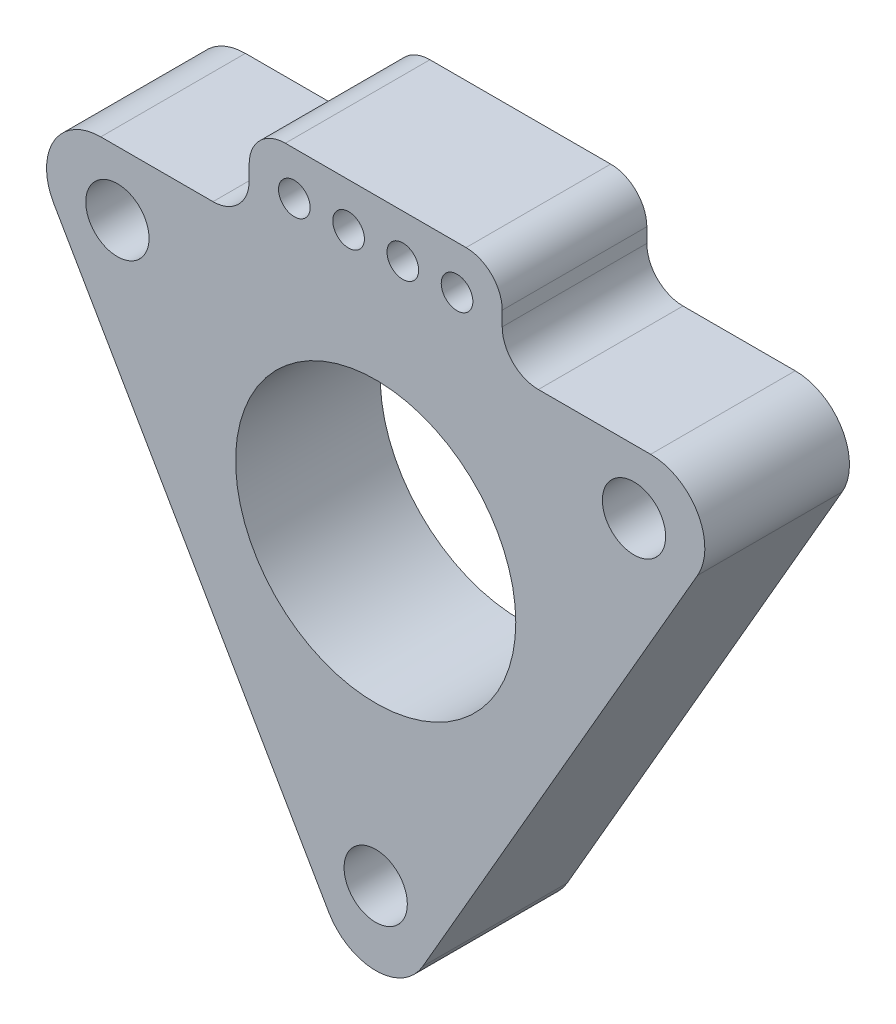
ISO-10303-21;
HEADER;
FILE_DESCRIPTION(('STEP AP214'),'2;1');
FILE_NAME('part.step','',(''),(''),'','','');
FILE_SCHEMA(('AUTOMOTIVE_DESIGN { 1 0 10303 214 1 1 1 1 }'));
ENDSEC;
DATA;
#1=APPLICATION_CONTEXT('core data for automotive mechanical design processes');
#2=APPLICATION_PROTOCOL_DEFINITION('international standard','automotive_design',2000,#1);
#3=PRODUCT_CONTEXT('',#1,'mechanical');
#4=PRODUCT('Part','Part','',(#3));
#5=PRODUCT_RELATED_PRODUCT_CATEGORY('part','',(#4));
#6=PRODUCT_DEFINITION_FORMATION('','',#4);
#7=PRODUCT_DEFINITION_CONTEXT('part definition',#1,'design');
#8=PRODUCT_DEFINITION('design','',#6,#7);
#9=PRODUCT_DEFINITION_SHAPE('','',#8);
#10=(LENGTH_UNIT() NAMED_UNIT(*) SI_UNIT(.MILLI.,.METRE.));
#11=(NAMED_UNIT(*) PLANE_ANGLE_UNIT() SI_UNIT($,.RADIAN.));
#12=(NAMED_UNIT(*) SI_UNIT($,.STERADIAN.) SOLID_ANGLE_UNIT());
#13=UNCERTAINTY_MEASURE_WITH_UNIT(LENGTH_MEASURE(1.E-05),#10,'distance_accuracy_value','');
#14=(GEOMETRIC_REPRESENTATION_CONTEXT(3) GLOBAL_UNCERTAINTY_ASSIGNED_CONTEXT((#13)) GLOBAL_UNIT_ASSIGNED_CONTEXT((#10,
#11,#12)) REPRESENTATION_CONTEXT('',''));
#15=CARTESIAN_POINT('',(0.,0.,0.));
#16=DIRECTION('',(0.,0.,1.));
#17=DIRECTION('',(1.,0.,0.));
#18=AXIS2_PLACEMENT_3D('',#15,#16,#17);
#19=CARTESIAN_POINT('',(20.4053214197768,11.78,8.));
#20=DIRECTION('',(0.,-1.,0.));
#21=DIRECTION('',(0.,0.,-1.));
#22=AXIS2_PLACEMENT_3D('',#19,#20,#21);
#23=PLANE('',#22);
#24=DIRECTION('',(-1.,0.,0.));
#25=VECTOR('',#24,1.);
#26=CARTESIAN_POINT('',(20.4053214197768,11.78,0.));
#27=LINE('',#26,#25);
#28=CARTESIAN_POINT('',(15.2091689970702,11.78,0.));
#29=VERTEX_POINT('',#28);
#30=CARTESIAN_POINT('',(9.,11.78,0.));
#31=VERTEX_POINT('',#30);
#32=EDGE_CURVE('E166',#29,#31,#27,.T.);
#33=ORIENTED_EDGE('',*,*,#32,.T.);
#34=DIRECTION('',(0.,0.,-1.));
#35=VECTOR('',#34,1.);
#36=CARTESIAN_POINT('',(9.,11.78,8.));
#37=LINE('',#36,#35);
#38=CARTESIAN_POINT('',(9.,11.78,8.));
#39=VERTEX_POINT('',#38);
#40=EDGE_CURVE('E222',#31,#39,#37,.F.);
#41=ORIENTED_EDGE('',*,*,#40,.T.);
#42=DIRECTION('',(-1.,0.,0.));
#43=VECTOR('',#42,1.);
#44=CARTESIAN_POINT('',(20.4053214197768,11.78,8.));
#45=LINE('',#44,#43);
#46=CARTESIAN_POINT('',(15.2091689970702,11.78,8.));
#47=VERTEX_POINT('',#46);
#48=EDGE_CURVE('E268',#47,#39,#45,.T.);
#49=ORIENTED_EDGE('',*,*,#48,.F.);
#50=DIRECTION('',(0.,0.,-1.));
#51=VECTOR('',#50,1.);
#52=CARTESIAN_POINT('',(15.2091689970702,11.78,8.));
#53=LINE('',#52,#51);
#54=EDGE_CURVE('E191',#47,#29,#53,.T.);
#55=ORIENTED_EDGE('',*,*,#54,.T.);
#56=EDGE_LOOP('',(#33,#41,#49,#55));
#57=FACE_BOUND('',#56,.T.);
#58=ADVANCED_FACE('F34',(#57),#23,.F.);
#59=CARTESIAN_POINT('',(20.4053214197768,11.78,8.));
#60=DIRECTION('',(0.,0.,1.));
#61=DIRECTION('',(1.,0.,0.));
#62=AXIS2_PLACEMENT_3D('',#59,#60,#61);
#63=PLANE('',#62);
#64=CARTESIAN_POINT('',(-14.2894191628503,8.2499999997305,8.));
#65=DIRECTION('',(0.,0.,1.));
#66=DIRECTION('',(1.,0.,0.));
#67=AXIS2_PLACEMENT_3D('',#64,#65,#66);
#68=CIRCLE('',#67,1.7499965);
#69=CARTESIAN_POINT('',(-12.5394226628503,8.2499999997305,8.));
#70=VERTEX_POINT('',#69);
#71=EDGE_CURVE('E254',#70,#70,#68,.T.);
#72=ORIENTED_EDGE('',*,*,#71,.F.);
#73=EDGE_LOOP('',(#72));
#74=FACE_BOUND('',#73,.T.);
#75=CARTESIAN_POINT('',(0.,-16.49999999968,8.));
#76=DIRECTION('',(0.,0.,1.));
#77=DIRECTION('',(1.,0.,0.));
#78=AXIS2_PLACEMENT_3D('',#75,#76,#77);
#79=CIRCLE('',#78,1.7499965);
#80=CARTESIAN_POINT('',(1.7499965,-16.49999999968,8.));
#81=VERTEX_POINT('',#80);
#82=EDGE_CURVE('E164',#81,#81,#79,.T.);
#83=ORIENTED_EDGE('',*,*,#82,.F.);
#84=EDGE_LOOP('',(#83));
#85=FACE_BOUND('',#84,.T.);
#86=DIRECTION('',(1.,0.,0.));
#87=VECTOR('',#86,1.);
#88=CARTESIAN_POINT('',(7.,16.58,8.));
#89=LINE('',#88,#87);
#90=CARTESIAN_POINT('',(-5.,16.58,8.));
#91=VERTEX_POINT('',#90);
#92=CARTESIAN_POINT('',(5.,16.58,8.));
#93=VERTEX_POINT('',#92);
#94=EDGE_CURVE('E238',#91,#93,#89,.T.);
#95=ORIENTED_EDGE('',*,*,#94,.F.);
#96=CARTESIAN_POINT('',(-5.,14.58,8.));
#97=DIRECTION('',(0.,0.,1.));
#98=DIRECTION('',(1.,0.,0.));
#99=AXIS2_PLACEMENT_3D('',#96,#97,#98);
#100=CIRCLE('',#99,2.);
#101=CARTESIAN_POINT('',(-7.,14.58,8.));
#102=VERTEX_POINT('',#101);
#103=EDGE_CURVE('E216',#91,#102,#100,.T.);
#104=ORIENTED_EDGE('',*,*,#103,.T.);
#105=DIRECTION('',(0.,1.,0.));
#106=VECTOR('',#105,1.);
#107=CARTESIAN_POINT('',(-7.,16.58,8.));
#108=LINE('',#107,#106);
#109=CARTESIAN_POINT('',(-7.,13.78,8.));
#110=VERTEX_POINT('',#109);
#111=EDGE_CURVE('E241',#110,#102,#108,.T.);
#112=ORIENTED_EDGE('',*,*,#111,.F.);
#113=CARTESIAN_POINT('',(-9.,13.78,8.));
#114=DIRECTION('',(0.,0.,1.));
#115=DIRECTION('',(1.,0.,0.));
#116=AXIS2_PLACEMENT_3D('',#113,#114,#115);
#117=CIRCLE('',#116,2.);
#118=CARTESIAN_POINT('',(-9.,11.78,8.));
#119=VERTEX_POINT('',#118);
#120=EDGE_CURVE('E226',#110,#119,#117,.F.);
#121=ORIENTED_EDGE('',*,*,#120,.T.);
#122=CARTESIAN_POINT('',(-15.2091689970702,11.78,8.));
#123=VERTEX_POINT('',#122);
#124=EDGE_CURVE('E267',#119,#123,#45,.T.);
#125=ORIENTED_EDGE('',*,*,#124,.T.);
#126=CARTESIAN_POINT('',(-15.2091689970702,8.78,8.));
#127=DIRECTION('',(0.,0.,1.));
#128=DIRECTION('',(1.,0.,0.));
#129=AXIS2_PLACEMENT_3D('',#126,#127,#128);
#130=CIRCLE('',#129,3.);
#131=CARTESIAN_POINT('',(-17.8072452084235,7.28,8.));
#132=VERTEX_POINT('',#131);
#133=EDGE_CURVE('E187',#123,#132,#130,.T.);
#134=ORIENTED_EDGE('',*,*,#133,.T.);
#135=DIRECTION('',(0.499999999999998,-0.86602540378444,0.));
#136=VECTOR('',#135,1.);
#137=CARTESIAN_POINT('',(-20.4053214197768,11.78,8.));
#138=LINE('',#137,#136);
#139=CARTESIAN_POINT('',(-2.59807621135331,-19.0630534438271,8.));
#140=VERTEX_POINT('',#139);
#141=EDGE_CURVE('E172',#132,#140,#138,.T.);
#142=ORIENTED_EDGE('',*,*,#141,.T.);
#143=CARTESIAN_POINT('',(0.,-17.5630534438271,8.));
#144=DIRECTION('',(0.,0.,1.));
#145=DIRECTION('',(1.,0.,0.));
#146=AXIS2_PLACEMENT_3D('',#143,#144,#145);
#147=CIRCLE('',#146,3.);
#148=CARTESIAN_POINT('',(2.59807621135332,-19.0630534438271,8.));
#149=VERTEX_POINT('',#148);
#150=EDGE_CURVE('E189',#140,#149,#147,.T.);
#151=ORIENTED_EDGE('',*,*,#150,.T.);
#152=DIRECTION('',(0.499999999999998,0.86602540378444,0.));
#153=VECTOR('',#152,1.);
#154=CARTESIAN_POINT('',(0.,-23.5630534438271,8.));
#155=LINE('',#154,#153);
#156=CARTESIAN_POINT('',(17.8072452084235,7.28,8.));
#157=VERTEX_POINT('',#156);
#158=EDGE_CURVE('E155',#149,#157,#155,.T.);
#159=ORIENTED_EDGE('',*,*,#158,.T.);
#160=CARTESIAN_POINT('',(15.2091689970702,8.78,8.));
#161=DIRECTION('',(0.,0.,1.));
#162=DIRECTION('',(1.,0.,0.));
#163=AXIS2_PLACEMENT_3D('',#160,#161,#162);
#164=CIRCLE('',#163,3.);
#165=EDGE_CURVE('E185',#157,#47,#164,.T.);
#166=ORIENTED_EDGE('',*,*,#165,.T.);
#167=ORIENTED_EDGE('',*,*,#48,.T.);
#168=CARTESIAN_POINT('',(9.,13.78,8.));
#169=DIRECTION('',(0.,0.,1.));
#170=DIRECTION('',(1.,0.,0.));
#171=AXIS2_PLACEMENT_3D('',#168,#169,#170);
#172=CIRCLE('',#171,2.);
#173=CARTESIAN_POINT('',(7.,13.78,8.));
#174=VERTEX_POINT('',#173);
#175=EDGE_CURVE('E11',#39,#174,#172,.F.);
#176=ORIENTED_EDGE('',*,*,#175,.T.);
#177=DIRECTION('',(0.,-1.,0.));
#178=VECTOR('',#177,1.);
#179=CARTESIAN_POINT('',(7.,11.78,8.));
#180=LINE('',#179,#178);
#181=CARTESIAN_POINT('',(7.,14.58,8.));
#182=VERTEX_POINT('',#181);
#183=EDGE_CURVE('E236',#182,#174,#180,.T.);
#184=ORIENTED_EDGE('',*,*,#183,.F.);
#185=CARTESIAN_POINT('',(5.,14.58,8.));
#186=DIRECTION('',(0.,0.,1.));
#187=DIRECTION('',(1.,0.,0.));
#188=AXIS2_PLACEMENT_3D('',#185,#186,#187);
#189=CIRCLE('',#188,2.);
#190=EDGE_CURVE('E214',#182,#93,#189,.T.);
#191=ORIENTED_EDGE('',*,*,#190,.T.);
#192=EDGE_LOOP('',(#95,#104,#112,#121,#125,#134,#142,#151,#159,#166,#167,#176,#184,#191));
#193=FACE_BOUND('',#192,.T.);
#194=CARTESIAN_POINT('',(0.,0.,8.));
#195=DIRECTION('',(0.,0.,1.));
#196=DIRECTION('',(1.,0.,0.));
#197=AXIS2_PLACEMENT_3D('',#194,#195,#196);
#198=CIRCLE('',#197,7.74999999999999);
#199=CARTESIAN_POINT('',(7.74999999999999,0.,8.));
#200=VERTEX_POINT('',#199);
#201=EDGE_CURVE('E260',#200,#200,#198,.T.);
#202=ORIENTED_EDGE('',*,*,#201,.F.);
#203=EDGE_LOOP('',(#202));
#204=FACE_BOUND('',#203,.T.);
#205=CARTESIAN_POINT('',(14.2894191628503,8.2499999997305,8.));
#206=DIRECTION('',(0.,0.,1.));
#207=DIRECTION('',(1.,0.,0.));
#208=AXIS2_PLACEMENT_3D('',#205,#206,#207);
#209=CIRCLE('',#208,1.7499965);
#210=CARTESIAN_POINT('',(16.0394156628503,8.2499999997305,8.));
#211=VERTEX_POINT('',#210);
#212=EDGE_CURVE('E246',#211,#211,#209,.T.);
#213=ORIENTED_EDGE('',*,*,#212,.F.);
#214=EDGE_LOOP('',(#213));
#215=FACE_BOUND('',#214,.T.);
#216=CARTESIAN_POINT('',(4.5,14.18,8.));
#217=DIRECTION('',(0.,0.,1.));
#218=DIRECTION('',(1.,0.,0.));
#219=AXIS2_PLACEMENT_3D('',#216,#217,#218);
#220=CIRCLE('',#219,0.875000000000001);
#221=CARTESIAN_POINT('',(5.375,14.18,8.));
#222=VERTEX_POINT('',#221);
#223=EDGE_CURVE('E534',#222,#222,#220,.F.);
#224=ORIENTED_EDGE('',*,*,#223,.T.);
#225=EDGE_LOOP('',(#224));
#226=FACE_BOUND('',#225,.T.);
#227=CARTESIAN_POINT('',(-4.5,14.18,8.));
#228=DIRECTION('',(0.,0.,1.));
#229=DIRECTION('',(1.,0.,0.));
#230=AXIS2_PLACEMENT_3D('',#227,#228,#229);
#231=CIRCLE('',#230,0.875);
#232=CARTESIAN_POINT('',(-3.625,14.18,8.));
#233=VERTEX_POINT('',#232);
#234=EDGE_CURVE('E532',#233,#233,#231,.F.);
#235=ORIENTED_EDGE('',*,*,#234,.T.);
#236=EDGE_LOOP('',(#235));
#237=FACE_BOUND('',#236,.T.);
#238=CARTESIAN_POINT('',(-1.5,14.18,8.));
#239=DIRECTION('',(0.,0.,1.));
#240=DIRECTION('',(1.,0.,0.));
#241=AXIS2_PLACEMENT_3D('',#238,#239,#240);
#242=CIRCLE('',#241,0.875000000000002);
#243=CARTESIAN_POINT('',(-0.624999999999998,14.18,8.));
#244=VERTEX_POINT('',#243);
#245=EDGE_CURVE('E529',#244,#244,#242,.F.);
#246=ORIENTED_EDGE('',*,*,#245,.T.);
#247=EDGE_LOOP('',(#246));
#248=FACE_BOUND('',#247,.T.);
#249=CARTESIAN_POINT('',(1.5,14.18,8.));
#250=DIRECTION('',(0.,0.,1.));
#251=DIRECTION('',(1.,0.,0.));
#252=AXIS2_PLACEMENT_3D('',#249,#250,#251);
#253=CIRCLE('',#252,0.875000000000001);
#254=CARTESIAN_POINT('',(2.375,14.18,8.));
#255=VERTEX_POINT('',#254);
#256=EDGE_CURVE('E253',#255,#255,#253,.F.);
#257=ORIENTED_EDGE('',*,*,#256,.T.);
#258=EDGE_LOOP('',(#257));
#259=FACE_BOUND('',#258,.T.);
#260=ADVANCED_FACE('F272',(#74,#85,#193,#204,#215,#226,#237,#248,#259),#63,.T.);
#261=CARTESIAN_POINT('',(20.4053214197768,11.78,0.));
#262=DIRECTION('',(0.,0.,1.));
#263=DIRECTION('',(1.,0.,0.));
#264=AXIS2_PLACEMENT_3D('',#261,#262,#263);
#265=PLANE('',#264);
#266=CARTESIAN_POINT('',(-14.2894191628503,8.2499999997305,0.));
#267=DIRECTION('',(0.,0.,1.));
#268=DIRECTION('',(1.,0.,0.));
#269=AXIS2_PLACEMENT_3D('',#266,#267,#268);
#270=CIRCLE('',#269,1.7499965);
#271=CARTESIAN_POINT('',(-12.5394226628503,8.2499999997305,0.));
#272=VERTEX_POINT('',#271);
#273=EDGE_CURVE('E249',#272,#272,#270,.T.);
#274=ORIENTED_EDGE('',*,*,#273,.T.);
#275=EDGE_LOOP('',(#274));
#276=FACE_BOUND('',#275,.T.);
#277=CARTESIAN_POINT('',(0.,-16.49999999968,0.));
#278=DIRECTION('',(0.,0.,1.));
#279=DIRECTION('',(1.,0.,0.));
#280=AXIS2_PLACEMENT_3D('',#277,#278,#279);
#281=CIRCLE('',#280,1.7499965);
#282=CARTESIAN_POINT('',(1.7499965,-16.49999999968,0.));
#283=VERTEX_POINT('',#282);
#284=EDGE_CURVE('E169',#283,#283,#281,.T.);
#285=ORIENTED_EDGE('',*,*,#284,.T.);
#286=EDGE_LOOP('',(#285));
#287=FACE_BOUND('',#286,.T.);
#288=DIRECTION('',(0.,1.,0.));
#289=VECTOR('',#288,1.);
#290=CARTESIAN_POINT('',(-7.,16.58,0.));
#291=LINE('',#290,#289);
#292=CARTESIAN_POINT('',(-7.,13.78,0.));
#293=VERTEX_POINT('',#292);
#294=CARTESIAN_POINT('',(-7.,14.58,0.));
#295=VERTEX_POINT('',#294);
#296=EDGE_CURVE('E289',#293,#295,#291,.T.);
#297=ORIENTED_EDGE('',*,*,#296,.T.);
#298=CARTESIAN_POINT('',(-5.,14.58,0.));
#299=DIRECTION('',(0.,0.,1.));
#300=DIRECTION('',(1.,0.,0.));
#301=AXIS2_PLACEMENT_3D('',#298,#299,#300);
#302=CIRCLE('',#301,2.);
#303=CARTESIAN_POINT('',(-5.,16.58,0.));
#304=VERTEX_POINT('',#303);
#305=EDGE_CURVE('E207',#295,#304,#302,.F.);
#306=ORIENTED_EDGE('',*,*,#305,.T.);
#307=DIRECTION('',(1.,0.,0.));
#308=VECTOR('',#307,1.);
#309=CARTESIAN_POINT('',(7.,16.58,0.));
#310=LINE('',#309,#308);
#311=CARTESIAN_POINT('',(5.,16.58,0.));
#312=VERTEX_POINT('',#311);
#313=EDGE_CURVE('E296',#304,#312,#310,.T.);
#314=ORIENTED_EDGE('',*,*,#313,.T.);
#315=CARTESIAN_POINT('',(5.,14.58,0.));
#316=DIRECTION('',(0.,0.,1.));
#317=DIRECTION('',(1.,0.,0.));
#318=AXIS2_PLACEMENT_3D('',#315,#316,#317);
#319=CIRCLE('',#318,2.);
#320=CARTESIAN_POINT('',(7.,14.58,0.));
#321=VERTEX_POINT('',#320);
#322=EDGE_CURVE('E205',#312,#321,#319,.F.);
#323=ORIENTED_EDGE('',*,*,#322,.T.);
#324=DIRECTION('',(0.,-1.,0.));
#325=VECTOR('',#324,1.);
#326=CARTESIAN_POINT('',(7.,11.78,0.));
#327=LINE('',#326,#325);
#328=CARTESIAN_POINT('',(7.,13.78,0.));
#329=VERTEX_POINT('',#328);
#330=EDGE_CURVE('E228',#321,#329,#327,.T.);
#331=ORIENTED_EDGE('',*,*,#330,.T.);
#332=CARTESIAN_POINT('',(9.,13.78,0.));
#333=DIRECTION('',(0.,0.,1.));
#334=DIRECTION('',(1.,0.,0.));
#335=AXIS2_PLACEMENT_3D('',#332,#333,#334);
#336=CIRCLE('',#335,2.);
#337=EDGE_CURVE('E42',#329,#31,#336,.T.);
#338=ORIENTED_EDGE('',*,*,#337,.T.);
#339=ORIENTED_EDGE('',*,*,#32,.F.);
#340=CARTESIAN_POINT('',(15.2091689970702,8.78,0.));
#341=DIRECTION('',(0.,0.,1.));
#342=DIRECTION('',(1.,0.,0.));
#343=AXIS2_PLACEMENT_3D('',#340,#341,#342);
#344=CIRCLE('',#343,3.);
#345=CARTESIAN_POINT('',(17.8072452084235,7.28,0.));
#346=VERTEX_POINT('',#345);
#347=EDGE_CURVE('E156',#29,#346,#344,.F.);
#348=ORIENTED_EDGE('',*,*,#347,.T.);
#349=DIRECTION('',(0.499999999999998,0.86602540378444,0.));
#350=VECTOR('',#349,1.);
#351=CARTESIAN_POINT('',(0.,-23.5630534438271,0.));
#352=LINE('',#351,#350);
#353=CARTESIAN_POINT('',(2.59807621135332,-19.0630534438271,0.));
#354=VERTEX_POINT('',#353);
#355=EDGE_CURVE('E152',#354,#346,#352,.T.);
#356=ORIENTED_EDGE('',*,*,#355,.F.);
#357=CARTESIAN_POINT('',(0.,-17.5630534438271,0.));
#358=DIRECTION('',(0.,0.,1.));
#359=DIRECTION('',(1.,0.,0.));
#360=AXIS2_PLACEMENT_3D('',#357,#358,#359);
#361=CIRCLE('',#360,3.);
#362=CARTESIAN_POINT('',(-2.59807621135331,-19.0630534438271,0.));
#363=VERTEX_POINT('',#362);
#364=EDGE_CURVE('E135',#354,#363,#361,.F.);
#365=ORIENTED_EDGE('',*,*,#364,.T.);
#366=DIRECTION('',(0.499999999999998,-0.86602540378444,0.));
#367=VECTOR('',#366,1.);
#368=CARTESIAN_POINT('',(-20.4053214197768,11.78,0.));
#369=LINE('',#368,#367);
#370=CARTESIAN_POINT('',(-17.8072452084235,7.28,0.));
#371=VERTEX_POINT('',#370);
#372=EDGE_CURVE('E176',#371,#363,#369,.T.);
#373=ORIENTED_EDGE('',*,*,#372,.F.);
#374=CARTESIAN_POINT('',(-15.2091689970702,8.78,0.));
#375=DIRECTION('',(0.,0.,1.));
#376=DIRECTION('',(1.,0.,0.));
#377=AXIS2_PLACEMENT_3D('',#374,#375,#376);
#378=CIRCLE('',#377,3.);
#379=CARTESIAN_POINT('',(-15.2091689970702,11.78,0.));
#380=VERTEX_POINT('',#379);
#381=EDGE_CURVE('E146',#371,#380,#378,.F.);
#382=ORIENTED_EDGE('',*,*,#381,.T.);
#383=CARTESIAN_POINT('',(-9.,11.78,0.));
#384=VERTEX_POINT('',#383);
#385=EDGE_CURVE('E163',#384,#380,#27,.T.);
#386=ORIENTED_EDGE('',*,*,#385,.F.);
#387=CARTESIAN_POINT('',(-9.,13.78,0.));
#388=DIRECTION('',(0.,0.,1.));
#389=DIRECTION('',(1.,0.,0.));
#390=AXIS2_PLACEMENT_3D('',#387,#388,#389);
#391=CIRCLE('',#390,2.);
#392=EDGE_CURVE('E224',#384,#293,#391,.T.);
#393=ORIENTED_EDGE('',*,*,#392,.T.);
#394=EDGE_LOOP('',(#297,#306,#314,#323,#331,#338,#339,#348,#356,#365,#373,#382,#386,#393));
#395=FACE_BOUND('',#394,.T.);
#396=CARTESIAN_POINT('',(0.,0.,0.));
#397=DIRECTION('',(0.,0.,1.));
#398=DIRECTION('',(1.,0.,0.));
#399=AXIS2_PLACEMENT_3D('',#396,#397,#398);
#400=CIRCLE('',#399,7.74999999999999);
#401=CARTESIAN_POINT('',(7.74999999999999,0.,0.));
#402=VERTEX_POINT('',#401);
#403=EDGE_CURVE('E257',#402,#402,#400,.T.);
#404=ORIENTED_EDGE('',*,*,#403,.T.);
#405=EDGE_LOOP('',(#404));
#406=FACE_BOUND('',#405,.T.);
#407=CARTESIAN_POINT('',(14.2894191628503,8.2499999997305,0.));
#408=DIRECTION('',(0.,0.,1.));
#409=DIRECTION('',(1.,0.,0.));
#410=AXIS2_PLACEMENT_3D('',#407,#408,#409);
#411=CIRCLE('',#410,1.7499965);
#412=CARTESIAN_POINT('',(16.0394156628503,8.2499999997305,0.));
#413=VERTEX_POINT('',#412);
#414=EDGE_CURVE('E250',#413,#413,#411,.T.);
#415=ORIENTED_EDGE('',*,*,#414,.T.);
#416=EDGE_LOOP('',(#415));
#417=FACE_BOUND('',#416,.T.);
#418=CARTESIAN_POINT('',(-4.5,14.18,0.));
#419=DIRECTION('',(0.,0.,-1.));
#420=DIRECTION('',(-1.,0.,0.));
#421=AXIS2_PLACEMENT_3D('',#418,#419,#420);
#422=CIRCLE('',#421,0.875);
#423=CARTESIAN_POINT('',(-5.375,14.18,0.));
#424=VERTEX_POINT('',#423);
#425=EDGE_CURVE('E297',#424,#424,#422,.T.);
#426=ORIENTED_EDGE('',*,*,#425,.F.);
#427=EDGE_LOOP('',(#426));
#428=FACE_BOUND('',#427,.T.);
#429=CARTESIAN_POINT('',(-1.5,14.18,0.));
#430=DIRECTION('',(0.,0.,-1.));
#431=DIRECTION('',(-1.,0.,0.));
#432=AXIS2_PLACEMENT_3D('',#429,#430,#431);
#433=CIRCLE('',#432,0.875000000000002);
#434=CARTESIAN_POINT('',(-2.375,14.18,0.));
#435=VERTEX_POINT('',#434);
#436=EDGE_CURVE('E519',#435,#435,#433,.T.);
#437=ORIENTED_EDGE('',*,*,#436,.F.);
#438=EDGE_LOOP('',(#437));
#439=FACE_BOUND('',#438,.T.);
#440=CARTESIAN_POINT('',(4.5,14.18,0.));
#441=DIRECTION('',(0.,0.,-1.));
#442=DIRECTION('',(-1.,0.,0.));
#443=AXIS2_PLACEMENT_3D('',#440,#441,#442);
#444=CIRCLE('',#443,0.875000000000001);
#445=CARTESIAN_POINT('',(3.625,14.18,0.));
#446=VERTEX_POINT('',#445);
#447=EDGE_CURVE('E515',#446,#446,#444,.T.);
#448=ORIENTED_EDGE('',*,*,#447,.F.);
#449=EDGE_LOOP('',(#448));
#450=FACE_BOUND('',#449,.T.);
#451=CARTESIAN_POINT('',(1.5,14.18,0.));
#452=DIRECTION('',(0.,0.,-1.));
#453=DIRECTION('',(-1.,0.,0.));
#454=AXIS2_PLACEMENT_3D('',#451,#452,#453);
#455=CIRCLE('',#454,0.875000000000001);
#456=CARTESIAN_POINT('',(0.624999999999999,14.18,0.));
#457=VERTEX_POINT('',#456);
#458=EDGE_CURVE('E513',#457,#457,#455,.T.);
#459=ORIENTED_EDGE('',*,*,#458,.F.);
#460=EDGE_LOOP('',(#459));
#461=FACE_BOUND('',#460,.T.);
#462=ADVANCED_FACE('F160',(#276,#287,#395,#406,#417,#428,#439,#450,#461),#265,.F.);
#463=CARTESIAN_POINT('',(0.,-23.5630534438271,8.));
#464=DIRECTION('',(-0.86602540378444,0.499999999999998,0.));
#465=DIRECTION('',(-0.499999999999998,-0.86602540378444,0.));
#466=AXIS2_PLACEMENT_3D('',#463,#464,#465);
#467=PLANE('',#466);
#468=ORIENTED_EDGE('',*,*,#158,.F.);
#469=DIRECTION('',(0.,0.,-1.));
#470=VECTOR('',#469,1.);
#471=CARTESIAN_POINT('',(2.59807621135332,-19.0630534438271,8.));
#472=LINE('',#471,#470);
#473=EDGE_CURVE('E139',#149,#354,#472,.T.);
#474=ORIENTED_EDGE('',*,*,#473,.T.);
#475=ORIENTED_EDGE('',*,*,#355,.T.);
#476=DIRECTION('',(0.,0.,-1.));
#477=VECTOR('',#476,1.);
#478=CARTESIAN_POINT('',(17.8072452084235,7.28,8.));
#479=LINE('',#478,#477);
#480=EDGE_CURVE('E157',#346,#157,#479,.F.);
#481=ORIENTED_EDGE('',*,*,#480,.T.);
#482=EDGE_LOOP('',(#468,#474,#475,#481));
#483=FACE_BOUND('',#482,.T.);
#484=ADVANCED_FACE('F151',(#483),#467,.F.);
#485=ORIENTED_EDGE('',*,*,#124,.F.);
#486=DIRECTION('',(0.,0.,-1.));
#487=VECTOR('',#486,1.);
#488=CARTESIAN_POINT('',(-9.,11.78,8.));
#489=LINE('',#488,#487);
#490=EDGE_CURVE('E197',#119,#384,#489,.T.);
#491=ORIENTED_EDGE('',*,*,#490,.T.);
#492=ORIENTED_EDGE('',*,*,#385,.T.);
#493=DIRECTION('',(0.,0.,-1.));
#494=VECTOR('',#493,1.);
#495=CARTESIAN_POINT('',(-15.2091689970702,11.78,8.));
#496=LINE('',#495,#494);
#497=EDGE_CURVE('E194',#380,#123,#496,.F.);
#498=ORIENTED_EDGE('',*,*,#497,.T.);
#499=EDGE_LOOP('',(#485,#491,#492,#498));
#500=FACE_BOUND('',#499,.T.);
#501=ADVANCED_FACE('F281',(#500),#23,.F.);
#502=CARTESIAN_POINT('',(-20.4053214197768,11.78,8.));
#503=DIRECTION('',(0.86602540378444,0.499999999999998,0.));
#504=DIRECTION('',(-0.499999999999998,0.86602540378444,0.));
#505=AXIS2_PLACEMENT_3D('',#502,#503,#504);
#506=PLANE('',#505);
#507=ORIENTED_EDGE('',*,*,#372,.T.);
#508=DIRECTION('',(0.,0.,-1.));
#509=VECTOR('',#508,1.);
#510=CARTESIAN_POINT('',(-2.59807621135331,-19.0630534438271,8.));
#511=LINE('',#510,#509);
#512=EDGE_CURVE('E140',#363,#140,#511,.F.);
#513=ORIENTED_EDGE('',*,*,#512,.T.);
#514=ORIENTED_EDGE('',*,*,#141,.F.);
#515=DIRECTION('',(0.,0.,-1.));
#516=VECTOR('',#515,1.);
#517=CARTESIAN_POINT('',(-17.8072452084235,7.28000000000001,8.));
#518=LINE('',#517,#516);
#519=EDGE_CURVE('E145',#132,#371,#518,.T.);
#520=ORIENTED_EDGE('',*,*,#519,.T.);
#521=EDGE_LOOP('',(#507,#513,#514,#520));
#522=FACE_BOUND('',#521,.T.);
#523=ADVANCED_FACE('F287',(#522),#506,.F.);
#524=CARTESIAN_POINT('',(0.,-16.49999999968,8.));
#525=DIRECTION('',(0.,0.,-1.));
#526=DIRECTION('',(-1.,0.,0.));
#527=AXIS2_PLACEMENT_3D('',#524,#525,#526);
#528=CYLINDRICAL_SURFACE('',#527,1.7499965);
#529=ORIENTED_EDGE('',*,*,#82,.T.);
#530=EDGE_LOOP('',(#529));
#531=FACE_BOUND('',#530,.T.);
#532=ORIENTED_EDGE('',*,*,#284,.F.);
#533=EDGE_LOOP('',(#532));
#534=FACE_BOUND('',#533,.T.);
#535=ADVANCED_FACE('F329',(#531,#534),#528,.F.);
#536=CARTESIAN_POINT('',(0.,0.,8.));
#537=DIRECTION('',(0.,0.,-1.));
#538=DIRECTION('',(-1.,0.,0.));
#539=AXIS2_PLACEMENT_3D('',#536,#537,#538);
#540=CYLINDRICAL_SURFACE('',#539,7.74999999999999);
#541=ORIENTED_EDGE('',*,*,#201,.T.);
#542=EDGE_LOOP('',(#541));
#543=FACE_BOUND('',#542,.T.);
#544=ORIENTED_EDGE('',*,*,#403,.F.);
#545=EDGE_LOOP('',(#544));
#546=FACE_BOUND('',#545,.T.);
#547=ADVANCED_FACE('F373',(#543,#546),#540,.F.);
#548=CARTESIAN_POINT('',(-14.2894191628503,8.2499999997305,8.));
#549=DIRECTION('',(0.,0.,-1.));
#550=DIRECTION('',(-1.,0.,0.));
#551=AXIS2_PLACEMENT_3D('',#548,#549,#550);
#552=CYLINDRICAL_SURFACE('',#551,1.7499965);
#553=ORIENTED_EDGE('',*,*,#71,.T.);
#554=EDGE_LOOP('',(#553));
#555=FACE_BOUND('',#554,.T.);
#556=ORIENTED_EDGE('',*,*,#273,.F.);
#557=EDGE_LOOP('',(#556));
#558=FACE_BOUND('',#557,.T.);
#559=ADVANCED_FACE('F369',(#555,#558),#552,.F.);
#560=CARTESIAN_POINT('',(14.2894191628503,8.2499999997305,8.));
#561=DIRECTION('',(0.,0.,-1.));
#562=DIRECTION('',(-1.,0.,0.));
#563=AXIS2_PLACEMENT_3D('',#560,#561,#562);
#564=CYLINDRICAL_SURFACE('',#563,1.7499965);
#565=ORIENTED_EDGE('',*,*,#212,.T.);
#566=EDGE_LOOP('',(#565));
#567=FACE_BOUND('',#566,.T.);
#568=ORIENTED_EDGE('',*,*,#414,.F.);
#569=EDGE_LOOP('',(#568));
#570=FACE_BOUND('',#569,.T.);
#571=ADVANCED_FACE('F338',(#567,#570),#564,.F.);
#572=CARTESIAN_POINT('',(0.,-17.5630534438271,8.));
#573=DIRECTION('',(0.,0.,-1.));
#574=DIRECTION('',(-1.,0.,0.));
#575=AXIS2_PLACEMENT_3D('',#572,#573,#574);
#576=CYLINDRICAL_SURFACE('',#575,3.);
#577=ORIENTED_EDGE('',*,*,#150,.F.);
#578=ORIENTED_EDGE('',*,*,#512,.F.);
#579=ORIENTED_EDGE('',*,*,#364,.F.);
#580=ORIENTED_EDGE('',*,*,#473,.F.);
#581=EDGE_LOOP('',(#577,#578,#579,#580));
#582=FACE_BOUND('',#581,.T.);
#583=ADVANCED_FACE('F138',(#582),#576,.T.);
#584=CARTESIAN_POINT('',(-15.2091689970702,8.78,8.));
#585=DIRECTION('',(0.,0.,-1.));
#586=DIRECTION('',(-1.,0.,0.));
#587=AXIS2_PLACEMENT_3D('',#584,#585,#586);
#588=CYLINDRICAL_SURFACE('',#587,3.);
#589=ORIENTED_EDGE('',*,*,#133,.F.);
#590=ORIENTED_EDGE('',*,*,#497,.F.);
#591=ORIENTED_EDGE('',*,*,#381,.F.);
#592=ORIENTED_EDGE('',*,*,#519,.F.);
#593=EDGE_LOOP('',(#589,#590,#591,#592));
#594=FACE_BOUND('',#593,.T.);
#595=ADVANCED_FACE('F285',(#594),#588,.T.);
#596=CARTESIAN_POINT('',(15.2091689970702,8.78,8.));
#597=DIRECTION('',(0.,0.,-1.));
#598=DIRECTION('',(-1.,0.,0.));
#599=AXIS2_PLACEMENT_3D('',#596,#597,#598);
#600=CYLINDRICAL_SURFACE('',#599,3.);
#601=ORIENTED_EDGE('',*,*,#165,.F.);
#602=ORIENTED_EDGE('',*,*,#480,.F.);
#603=ORIENTED_EDGE('',*,*,#347,.F.);
#604=ORIENTED_EDGE('',*,*,#54,.F.);
#605=EDGE_LOOP('',(#601,#602,#603,#604));
#606=FACE_BOUND('',#605,.T.);
#607=ADVANCED_FACE('F340',(#606),#600,.T.);
#608=CARTESIAN_POINT('',(7.,11.78,22.8));
#609=DIRECTION('',(1.,0.,0.));
#610=DIRECTION('',(0.,0.,-1.));
#611=AXIS2_PLACEMENT_3D('',#608,#609,#610);
#612=PLANE('',#611);
#613=ORIENTED_EDGE('',*,*,#330,.F.);
#614=DIRECTION('',(0.,0.,-1.));
#615=VECTOR('',#614,1.);
#616=CARTESIAN_POINT('',(7.,14.58,22.8));
#617=LINE('',#616,#615);
#618=EDGE_CURVE('E54',#321,#182,#617,.F.);
#619=ORIENTED_EDGE('',*,*,#618,.T.);
#620=ORIENTED_EDGE('',*,*,#183,.T.);
#621=DIRECTION('',(0.,0.,-1.));
#622=VECTOR('',#621,1.);
#623=CARTESIAN_POINT('',(7.,13.78,22.8));
#624=LINE('',#623,#622);
#625=EDGE_CURVE('E218',#174,#329,#624,.T.);
#626=ORIENTED_EDGE('',*,*,#625,.T.);
#627=EDGE_LOOP('',(#613,#619,#620,#626));
#628=FACE_BOUND('',#627,.T.);
#629=ADVANCED_FACE('F235',(#628),#612,.T.);
#630=CARTESIAN_POINT('',(7.,16.58,22.8));
#631=DIRECTION('',(0.,1.,0.));
#632=DIRECTION('',(0.,0.,1.));
#633=AXIS2_PLACEMENT_3D('',#630,#631,#632);
#634=PLANE('',#633);
#635=ORIENTED_EDGE('',*,*,#313,.F.);
#636=DIRECTION('',(0.,0.,-1.));
#637=VECTOR('',#636,1.);
#638=CARTESIAN_POINT('',(-5.,16.58,22.8));
#639=LINE('',#638,#637);
#640=EDGE_CURVE('E212',#304,#91,#639,.F.);
#641=ORIENTED_EDGE('',*,*,#640,.T.);
#642=ORIENTED_EDGE('',*,*,#94,.T.);
#643=DIRECTION('',(0.,0.,-1.));
#644=VECTOR('',#643,1.);
#645=CARTESIAN_POINT('',(5.,16.58,22.8));
#646=LINE('',#645,#644);
#647=EDGE_CURVE('E209',#93,#312,#646,.T.);
#648=ORIENTED_EDGE('',*,*,#647,.T.);
#649=EDGE_LOOP('',(#635,#641,#642,#648));
#650=FACE_BOUND('',#649,.T.);
#651=ADVANCED_FACE('F346',(#650),#634,.T.);
#652=CARTESIAN_POINT('',(-7.,16.58,22.8));
#653=DIRECTION('',(-1.,0.,0.));
#654=DIRECTION('',(0.,0.,1.));
#655=AXIS2_PLACEMENT_3D('',#652,#653,#654);
#656=PLANE('',#655);
#657=ORIENTED_EDGE('',*,*,#296,.F.);
#658=DIRECTION('',(0.,0.,-1.));
#659=VECTOR('',#658,1.);
#660=CARTESIAN_POINT('',(-7.,13.78,22.8));
#661=LINE('',#660,#659);
#662=EDGE_CURVE('E203',#293,#110,#661,.F.);
#663=ORIENTED_EDGE('',*,*,#662,.T.);
#664=ORIENTED_EDGE('',*,*,#111,.T.);
#665=DIRECTION('',(0.,0.,-1.));
#666=VECTOR('',#665,1.);
#667=CARTESIAN_POINT('',(-7.,14.58,22.8));
#668=LINE('',#667,#666);
#669=EDGE_CURVE('E200',#102,#295,#668,.T.);
#670=ORIENTED_EDGE('',*,*,#669,.T.);
#671=EDGE_LOOP('',(#657,#663,#664,#670));
#672=FACE_BOUND('',#671,.T.);
#673=ADVANCED_FACE('F293',(#672),#656,.T.);
#674=CARTESIAN_POINT('',(1.5,14.18,22.8));
#675=DIRECTION('',(0.,0.,-1.));
#676=DIRECTION('',(-1.,0.,0.));
#677=AXIS2_PLACEMENT_3D('',#674,#675,#676);
#678=CYLINDRICAL_SURFACE('',#677,0.875000000000001);
#679=ORIENTED_EDGE('',*,*,#458,.T.);
#680=EDGE_LOOP('',(#679));
#681=FACE_BOUND('',#680,.T.);
#682=ORIENTED_EDGE('',*,*,#256,.F.);
#683=EDGE_LOOP('',(#682));
#684=FACE_BOUND('',#683,.T.);
#685=ADVANCED_FACE('F356',(#681,#684),#678,.F.);
#686=CARTESIAN_POINT('',(4.5,14.18,22.8));
#687=DIRECTION('',(0.,0.,-1.));
#688=DIRECTION('',(-1.,0.,0.));
#689=AXIS2_PLACEMENT_3D('',#686,#687,#688);
#690=CYLINDRICAL_SURFACE('',#689,0.875000000000001);
#691=ORIENTED_EDGE('',*,*,#447,.T.);
#692=EDGE_LOOP('',(#691));
#693=FACE_BOUND('',#692,.T.);
#694=ORIENTED_EDGE('',*,*,#223,.F.);
#695=EDGE_LOOP('',(#694));
#696=FACE_BOUND('',#695,.T.);
#697=ADVANCED_FACE('F359',(#693,#696),#690,.F.);
#698=CARTESIAN_POINT('',(-1.5,14.18,22.8));
#699=DIRECTION('',(0.,0.,-1.));
#700=DIRECTION('',(-1.,0.,0.));
#701=AXIS2_PLACEMENT_3D('',#698,#699,#700);
#702=CYLINDRICAL_SURFACE('',#701,0.875000000000002);
#703=ORIENTED_EDGE('',*,*,#436,.T.);
#704=EDGE_LOOP('',(#703));
#705=FACE_BOUND('',#704,.T.);
#706=ORIENTED_EDGE('',*,*,#245,.F.);
#707=EDGE_LOOP('',(#706));
#708=FACE_BOUND('',#707,.T.);
#709=ADVANCED_FACE('F311',(#705,#708),#702,.F.);
#710=CARTESIAN_POINT('',(-4.5,14.18,22.8));
#711=DIRECTION('',(0.,0.,-1.));
#712=DIRECTION('',(-1.,0.,0.));
#713=AXIS2_PLACEMENT_3D('',#710,#711,#712);
#714=CYLINDRICAL_SURFACE('',#713,0.875);
#715=ORIENTED_EDGE('',*,*,#425,.T.);
#716=EDGE_LOOP('',(#715));
#717=FACE_BOUND('',#716,.T.);
#718=ORIENTED_EDGE('',*,*,#234,.F.);
#719=EDGE_LOOP('',(#718));
#720=FACE_BOUND('',#719,.T.);
#721=ADVANCED_FACE('F302',(#717,#720),#714,.F.);
#722=CARTESIAN_POINT('',(-9.,13.78,8.));
#723=DIRECTION('',(0.,0.,-1.));
#724=DIRECTION('',(-1.,0.,0.));
#725=AXIS2_PLACEMENT_3D('',#722,#723,#724);
#726=CYLINDRICAL_SURFACE('',#725,2.);
#727=ORIENTED_EDGE('',*,*,#120,.F.);
#728=ORIENTED_EDGE('',*,*,#662,.F.);
#729=ORIENTED_EDGE('',*,*,#392,.F.);
#730=ORIENTED_EDGE('',*,*,#490,.F.);
#731=EDGE_LOOP('',(#727,#728,#729,#730));
#732=FACE_BOUND('',#731,.T.);
#733=ADVANCED_FACE('F299',(#732),#726,.F.);
#734=CARTESIAN_POINT('',(-5.,14.58,22.8));
#735=DIRECTION('',(0.,0.,-1.));
#736=DIRECTION('',(-1.,0.,0.));
#737=AXIS2_PLACEMENT_3D('',#734,#735,#736);
#738=CYLINDRICAL_SURFACE('',#737,2.);
#739=ORIENTED_EDGE('',*,*,#103,.F.);
#740=ORIENTED_EDGE('',*,*,#640,.F.);
#741=ORIENTED_EDGE('',*,*,#305,.F.);
#742=ORIENTED_EDGE('',*,*,#669,.F.);
#743=EDGE_LOOP('',(#739,#740,#741,#742));
#744=FACE_BOUND('',#743,.T.);
#745=ADVANCED_FACE('F301',(#744),#738,.T.);
#746=CARTESIAN_POINT('',(5.,14.58,22.8));
#747=DIRECTION('',(0.,0.,-1.));
#748=DIRECTION('',(-1.,0.,0.));
#749=AXIS2_PLACEMENT_3D('',#746,#747,#748);
#750=CYLINDRICAL_SURFACE('',#749,2.);
#751=ORIENTED_EDGE('',*,*,#190,.F.);
#752=ORIENTED_EDGE('',*,*,#618,.F.);
#753=ORIENTED_EDGE('',*,*,#322,.F.);
#754=ORIENTED_EDGE('',*,*,#647,.F.);
#755=EDGE_LOOP('',(#751,#752,#753,#754));
#756=FACE_BOUND('',#755,.T.);
#757=ADVANCED_FACE('F308',(#756),#750,.T.);
#758=CARTESIAN_POINT('',(9.,13.78,22.8));
#759=DIRECTION('',(0.,0.,-1.));
#760=DIRECTION('',(-1.,0.,0.));
#761=AXIS2_PLACEMENT_3D('',#758,#759,#760);
#762=CYLINDRICAL_SURFACE('',#761,2.);
#763=ORIENTED_EDGE('',*,*,#175,.F.);
#764=ORIENTED_EDGE('',*,*,#40,.F.);
#765=ORIENTED_EDGE('',*,*,#337,.F.);
#766=ORIENTED_EDGE('',*,*,#625,.F.);
#767=EDGE_LOOP('',(#763,#764,#765,#766));
#768=FACE_BOUND('',#767,.T.);
#769=ADVANCED_FACE('F36',(#768),#762,.F.);
#770=CLOSED_SHELL('',(#58,#260,#462,#484,#501,#523,#535,#547,#559,#571,#583,#595,#607,#629,#651,
#673,#685,#697,#709,#721,#733,#745,#757,#769));
#771=MANIFOLD_SOLID_BREP('B2',#770);
#772=ADVANCED_BREP_SHAPE_REPRESENTATION('',(#18,#771),#14);
#773=SHAPE_DEFINITION_REPRESENTATION(#9,#772);
ENDSEC;
END-ISO-10303-21;
